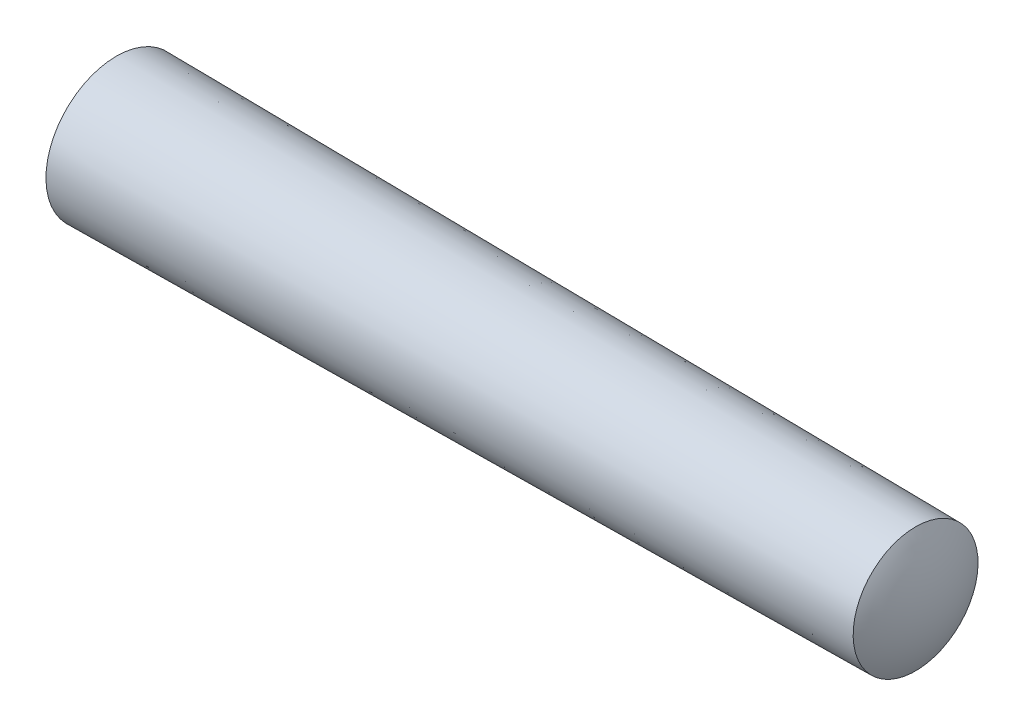
ISO-10303-21;
HEADER;
FILE_DESCRIPTION(('STEP AP214'),'2;1');
FILE_NAME('part.step','',(''),(''),'','','');
FILE_SCHEMA(('AUTOMOTIVE_DESIGN { 1 0 10303 214 1 1 1 1 }'));
ENDSEC;
DATA;
#1=APPLICATION_CONTEXT('core data for automotive mechanical design processes');
#2=APPLICATION_PROTOCOL_DEFINITION('international standard','automotive_design',2000,#1);
#3=PRODUCT_CONTEXT('',#1,'mechanical');
#4=PRODUCT('Part','Part','',(#3));
#5=PRODUCT_RELATED_PRODUCT_CATEGORY('part','',(#4));
#6=PRODUCT_DEFINITION_FORMATION('','',#4);
#7=PRODUCT_DEFINITION_CONTEXT('part definition',#1,'design');
#8=PRODUCT_DEFINITION('design','',#6,#7);
#9=PRODUCT_DEFINITION_SHAPE('','',#8);
#10=(LENGTH_UNIT() NAMED_UNIT(*) SI_UNIT(.MILLI.,.METRE.));
#11=(NAMED_UNIT(*) PLANE_ANGLE_UNIT() SI_UNIT($,.RADIAN.));
#12=(NAMED_UNIT(*) SI_UNIT($,.STERADIAN.) SOLID_ANGLE_UNIT());
#13=UNCERTAINTY_MEASURE_WITH_UNIT(LENGTH_MEASURE(1.E-05),#10,'distance_accuracy_value','');
#14=(GEOMETRIC_REPRESENTATION_CONTEXT(3) GLOBAL_UNCERTAINTY_ASSIGNED_CONTEXT((#13)) GLOBAL_UNIT_ASSIGNED_CONTEXT((#10,
#11,#12)) REPRESENTATION_CONTEXT('',''));
#15=CARTESIAN_POINT('',(0.,0.,0.));
#16=DIRECTION('',(0.,0.,1.));
#17=DIRECTION('',(1.,0.,0.));
#18=AXIS2_PLACEMENT_3D('',#15,#16,#17);
#19=CARTESIAN_POINT('',(0.675716000000028,0.,0.));
#20=DIRECTION('',(1.,0.,0.));
#21=DIRECTION('',(0.,1.,0.));
#22=AXIS2_PLACEMENT_3D('',#19,#20,#21);
#23=SPHERICAL_SURFACE('',#22,0.755716000000028);
#24=CARTESIAN_POINT('',(0.,0.,0.));
#25=DIRECTION('',(1.,0.,0.));
#26=DIRECTION('',(0.,1.,0.));
#27=AXIS2_PLACEMENT_3D('',#24,#25,#26);
#28=CIRCLE('',#27,0.338399999999999);
#29=CARTESIAN_POINT('',(0.,0.338399999999999,0.));
#30=VERTEX_POINT('',#29);
#31=EDGE_CURVE('E10',#30,#30,#28,.T.);
#32=ORIENTED_EDGE('',*,*,#31,.F.);
#33=EDGE_LOOP('',(#32));
#34=FACE_BOUND('',#33,.T.);
#35=ADVANCED_FACE('F27',(#34),#23,.T.);
#36=CARTESIAN_POINT('',(3.84,0.,0.));
#37=DIRECTION('',(-1.,0.,0.));
#38=DIRECTION('',(0.,-1.,0.));
#39=AXIS2_PLACEMENT_3D('',#36,#37,#38);
#40=CONICAL_SURFACE('',#39,0.300000000000002,0.00999966668666459);
#41=ORIENTED_EDGE('',*,*,#31,.T.);
#42=EDGE_LOOP('',(#41));
#43=FACE_BOUND('',#42,.T.);
#44=CARTESIAN_POINT('',(3.84,0.,0.));
#45=DIRECTION('',(1.,0.,0.));
#46=DIRECTION('',(0.,1.,0.));
#47=AXIS2_PLACEMENT_3D('',#44,#45,#46);
#48=CIRCLE('',#47,0.300000000000002);
#49=CARTESIAN_POINT('',(3.84,0.300000000000002,0.));
#50=VERTEX_POINT('',#49);
#51=EDGE_CURVE('E33',#50,#50,#48,.T.);
#52=ORIENTED_EDGE('',*,*,#51,.F.);
#53=EDGE_LOOP('',(#52));
#54=FACE_BOUND('',#53,.T.);
#55=ADVANCED_FACE('F41',(#43,#54),#40,.T.);
#56=CARTESIAN_POINT('',(3.31749999999994,0.,0.));
#57=DIRECTION('',(1.,0.,0.));
#58=DIRECTION('',(0.,1.,0.));
#59=AXIS2_PLACEMENT_3D('',#56,#57,#58);
#60=SPHERICAL_SURFACE('',#59,0.602500000000054);
#61=ORIENTED_EDGE('',*,*,#51,.T.);
#62=EDGE_LOOP('',(#61));
#63=FACE_BOUND('',#62,.T.);
#64=ADVANCED_FACE('F39',(#63),#60,.T.);
#65=CLOSED_SHELL('',(#35,#55,#64));
#66=MANIFOLD_SOLID_BREP('B2',#65);
#67=ADVANCED_BREP_SHAPE_REPRESENTATION('',(#18,#66),#14);
#68=SHAPE_DEFINITION_REPRESENTATION(#9,#67);
ENDSEC;
END-ISO-10303-21;
